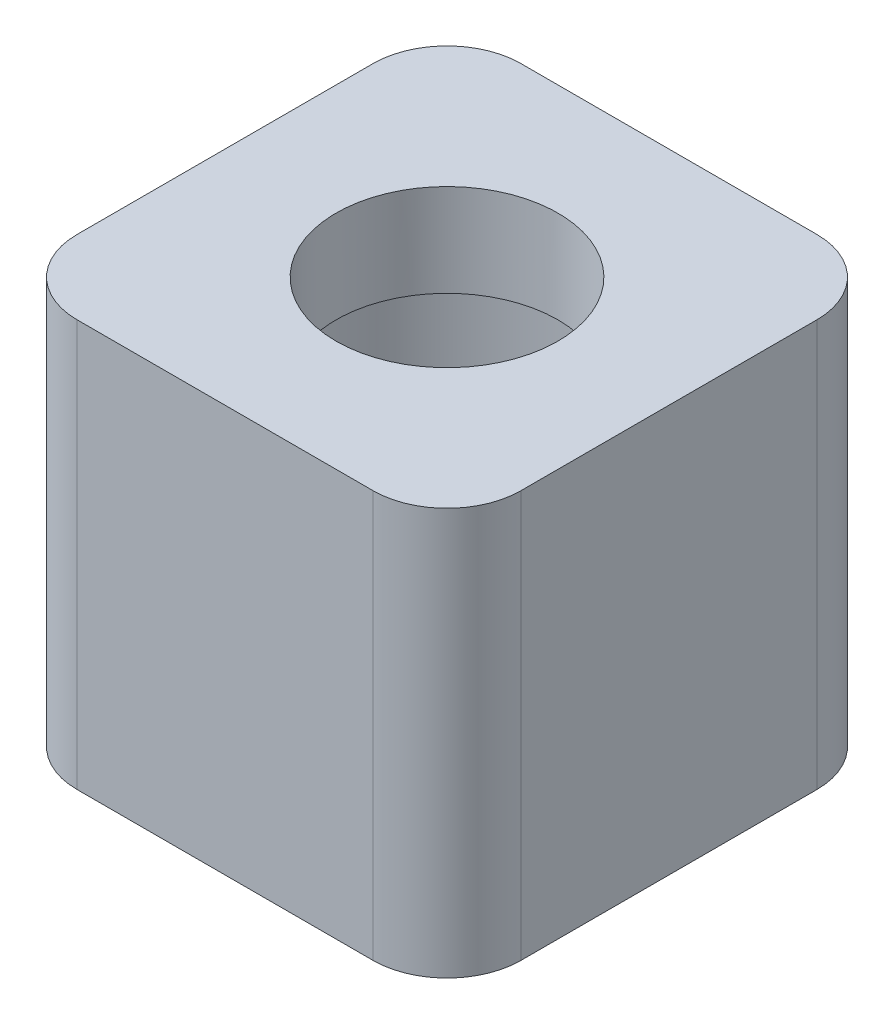
ISO-10303-21;
HEADER;
FILE_DESCRIPTION(('STEP AP214'),'2;1');
FILE_NAME('part.step','',(''),(''),'','','');
FILE_SCHEMA(('AUTOMOTIVE_DESIGN { 1 0 10303 214 1 1 1 1 }'));
ENDSEC;
DATA;
#1=APPLICATION_CONTEXT('core data for automotive mechanical design processes');
#2=APPLICATION_PROTOCOL_DEFINITION('international standard','automotive_design',2000,#1);
#3=PRODUCT_CONTEXT('',#1,'mechanical');
#4=PRODUCT('Part','Part','',(#3));
#5=PRODUCT_RELATED_PRODUCT_CATEGORY('part','',(#4));
#6=PRODUCT_DEFINITION_FORMATION('','',#4);
#7=PRODUCT_DEFINITION_CONTEXT('part definition',#1,'design');
#8=PRODUCT_DEFINITION('design','',#6,#7);
#9=PRODUCT_DEFINITION_SHAPE('','',#8);
#10=(LENGTH_UNIT() NAMED_UNIT(*) SI_UNIT(.MILLI.,.METRE.));
#11=(NAMED_UNIT(*) PLANE_ANGLE_UNIT() SI_UNIT($,.RADIAN.));
#12=(NAMED_UNIT(*) SI_UNIT($,.STERADIAN.) SOLID_ANGLE_UNIT());
#13=UNCERTAINTY_MEASURE_WITH_UNIT(LENGTH_MEASURE(1.E-05),#10,'distance_accuracy_value','');
#14=(GEOMETRIC_REPRESENTATION_CONTEXT(3) GLOBAL_UNCERTAINTY_ASSIGNED_CONTEXT((#13)) GLOBAL_UNIT_ASSIGNED_CONTEXT((#10,
#11,#12)) REPRESENTATION_CONTEXT('',''));
#15=CARTESIAN_POINT('',(0.,0.,0.));
#16=DIRECTION('',(0.,0.,1.));
#17=DIRECTION('',(1.,0.,0.));
#18=AXIS2_PLACEMENT_3D('',#15,#16,#17);
#19=CARTESIAN_POINT('',(-1.12492779512025,-4.24264068711929,-0.313350366891177));
#20=DIRECTION('',(0.,1.,0.));
#21=DIRECTION('',(0.,0.,1.));
#22=AXIS2_PLACEMENT_3D('',#19,#20,#21);
#23=CYLINDRICAL_SURFACE('',#22,1.5);
#24=CARTESIAN_POINT('',(-1.12492779512025,5.5,-0.313350366891177));
#25=DIRECTION('',(0.,1.,0.));
#26=DIRECTION('',(0.,0.,1.));
#27=AXIS2_PLACEMENT_3D('',#24,#25,#26);
#28=CIRCLE('',#27,1.5);
#29=CARTESIAN_POINT('',(-1.12492779512025,5.5,1.18664963310882));
#30=VERTEX_POINT('',#29);
#31=EDGE_CURVE('E136',#30,#30,#28,.T.);
#32=ORIENTED_EDGE('',*,*,#31,.T.);
#33=EDGE_LOOP('',(#32));
#34=FACE_BOUND('',#33,.T.);
#35=CARTESIAN_POINT('',(-1.12492779512025,4.25,-0.313350366891177));
#36=DIRECTION('',(0.,-1.,0.));
#37=DIRECTION('',(0.,0.,-1.));
#38=AXIS2_PLACEMENT_3D('',#35,#36,#37);
#39=CIRCLE('',#38,1.5);
#40=CARTESIAN_POINT('',(-1.12492779512025,4.25,-1.81335036689118));
#41=VERTEX_POINT('',#40);
#42=EDGE_CURVE('E38',#41,#41,#39,.F.);
#43=ORIENTED_EDGE('',*,*,#42,.F.);
#44=EDGE_LOOP('',(#43));
#45=FACE_BOUND('',#44,.T.);
#46=ADVANCED_FACE('F34',(#34,#45),#23,.F.);
#47=CARTESIAN_POINT('',(0.875072204879752,5.5,-2.31335036689118));
#48=DIRECTION('',(0.,-1.,0.));
#49=DIRECTION('',(0.,0.,-1.));
#50=AXIS2_PLACEMENT_3D('',#47,#48,#49);
#51=CYLINDRICAL_SURFACE('',#50,1.);
#52=CARTESIAN_POINT('',(0.875072204879752,0.,-2.31335036689118));
#53=DIRECTION('',(0.,1.,0.));
#54=DIRECTION('',(0.,0.,-1.));
#55=AXIS2_PLACEMENT_3D('',#52,#53,#54);
#56=CIRCLE('',#55,1.);
#57=CARTESIAN_POINT('',(1.87507220487975,0.,-2.31335036689117));
#58=VERTEX_POINT('',#57);
#59=CARTESIAN_POINT('',(0.875072204879745,0.,-3.31335036689118));
#60=VERTEX_POINT('',#59);
#61=EDGE_CURVE('E132',#58,#60,#56,.T.);
#62=ORIENTED_EDGE('',*,*,#61,.T.);
#63=DIRECTION('',(0.,-1.,0.));
#64=VECTOR('',#63,1.);
#65=CARTESIAN_POINT('',(0.875072204879745,5.5,-3.31335036689118));
#66=LINE('',#65,#64);
#67=CARTESIAN_POINT('',(0.875072204879745,5.5,-3.31335036689118));
#68=VERTEX_POINT('',#67);
#69=EDGE_CURVE('E11',#68,#60,#66,.T.);
#70=ORIENTED_EDGE('',*,*,#69,.F.);
#71=CARTESIAN_POINT('',(0.875072204879752,5.5,-2.31335036689118));
#72=DIRECTION('',(0.,1.,0.));
#73=DIRECTION('',(0.,0.,-1.));
#74=AXIS2_PLACEMENT_3D('',#71,#72,#73);
#75=CIRCLE('',#74,1.);
#76=CARTESIAN_POINT('',(1.87507220487975,5.5,-2.31335036689117));
#77=VERTEX_POINT('',#76);
#78=EDGE_CURVE('E147',#77,#68,#75,.T.);
#79=ORIENTED_EDGE('',*,*,#78,.F.);
#80=DIRECTION('',(0.,-1.,0.));
#81=VECTOR('',#80,1.);
#82=CARTESIAN_POINT('',(1.87507220487975,5.5,-2.31335036689117));
#83=LINE('',#82,#81);
#84=EDGE_CURVE('E128',#77,#58,#83,.T.);
#85=ORIENTED_EDGE('',*,*,#84,.T.);
#86=EDGE_LOOP('',(#62,#70,#79,#85));
#87=FACE_BOUND('',#86,.T.);
#88=ADVANCED_FACE('F36',(#87),#51,.T.);
#89=CARTESIAN_POINT('',(-3.12492779512024,5.5,-3.31335036689118));
#90=DIRECTION('',(0.,0.,1.));
#91=DIRECTION('',(1.,0.,0.));
#92=AXIS2_PLACEMENT_3D('',#89,#90,#91);
#93=PLANE('',#92);
#94=DIRECTION('',(-1.,0.,0.));
#95=VECTOR('',#94,1.);
#96=CARTESIAN_POINT('',(-3.12492779512024,0.,-3.31335036689118));
#97=LINE('',#96,#95);
#98=CARTESIAN_POINT('',(-3.12492779512024,0.,-3.31335036689118));
#99=VERTEX_POINT('',#98);
#100=EDGE_CURVE('E135',#60,#99,#97,.T.);
#101=ORIENTED_EDGE('',*,*,#100,.T.);
#102=DIRECTION('',(0.,-1.,0.));
#103=VECTOR('',#102,1.);
#104=CARTESIAN_POINT('',(-3.12492779512024,5.5,-3.31335036689118));
#105=LINE('',#104,#103);
#106=CARTESIAN_POINT('',(-3.12492779512024,5.5,-3.31335036689118));
#107=VERTEX_POINT('',#106);
#108=EDGE_CURVE('E44',#107,#99,#105,.T.);
#109=ORIENTED_EDGE('',*,*,#108,.F.);
#110=DIRECTION('',(-1.,0.,0.));
#111=VECTOR('',#110,1.);
#112=CARTESIAN_POINT('',(-3.12492779512024,5.5,-3.31335036689118));
#113=LINE('',#112,#111);
#114=EDGE_CURVE('E95',#68,#107,#113,.T.);
#115=ORIENTED_EDGE('',*,*,#114,.F.);
#116=ORIENTED_EDGE('',*,*,#69,.T.);
#117=EDGE_LOOP('',(#101,#109,#115,#116));
#118=FACE_BOUND('',#117,.T.);
#119=ADVANCED_FACE('F201',(#118),#93,.F.);
#120=CARTESIAN_POINT('',(-3.12492779512025,5.5,-2.31335036689118));
#121=DIRECTION('',(0.,-1.,0.));
#122=DIRECTION('',(0.,0.,-1.));
#123=AXIS2_PLACEMENT_3D('',#120,#121,#122);
#124=CYLINDRICAL_SURFACE('',#123,1.);
#125=CARTESIAN_POINT('',(-3.12492779512025,0.,-2.31335036689118));
#126=DIRECTION('',(0.,1.,0.));
#127=DIRECTION('',(0.,0.,1.));
#128=AXIS2_PLACEMENT_3D('',#125,#126,#127);
#129=CIRCLE('',#128,1.);
#130=CARTESIAN_POINT('',(-4.12492779512025,0.,-2.31335036689117));
#131=VERTEX_POINT('',#130);
#132=EDGE_CURVE('E138',#99,#131,#129,.T.);
#133=ORIENTED_EDGE('',*,*,#132,.T.);
#134=DIRECTION('',(0.,-1.,0.));
#135=VECTOR('',#134,1.);
#136=CARTESIAN_POINT('',(-4.12492779512025,5.5,-2.31335036689117));
#137=LINE('',#136,#135);
#138=CARTESIAN_POINT('',(-4.12492779512025,5.5,-2.31335036689117));
#139=VERTEX_POINT('',#138);
#140=EDGE_CURVE('E154',#139,#131,#137,.T.);
#141=ORIENTED_EDGE('',*,*,#140,.F.);
#142=CARTESIAN_POINT('',(-3.12492779512025,5.5,-2.31335036689118));
#143=DIRECTION('',(0.,1.,0.));
#144=DIRECTION('',(0.,0.,1.));
#145=AXIS2_PLACEMENT_3D('',#142,#143,#144);
#146=CIRCLE('',#145,1.);
#147=EDGE_CURVE('E163',#107,#139,#146,.T.);
#148=ORIENTED_EDGE('',*,*,#147,.F.);
#149=ORIENTED_EDGE('',*,*,#108,.T.);
#150=EDGE_LOOP('',(#133,#141,#148,#149));
#151=FACE_BOUND('',#150,.T.);
#152=ADVANCED_FACE('F161',(#151),#124,.T.);
#153=CARTESIAN_POINT('',(-4.12492779512025,5.5,-2.31335036689117));
#154=DIRECTION('',(1.,0.,0.));
#155=DIRECTION('',(0.,0.,-1.));
#156=AXIS2_PLACEMENT_3D('',#153,#154,#155);
#157=PLANE('',#156);
#158=DIRECTION('',(0.,0.,1.));
#159=VECTOR('',#158,1.);
#160=CARTESIAN_POINT('',(-4.12492779512025,0.,-2.31335036689117));
#161=LINE('',#160,#159);
#162=CARTESIAN_POINT('',(-4.12492779512025,0.,1.68664963310882));
#163=VERTEX_POINT('',#162);
#164=EDGE_CURVE('E140',#131,#163,#161,.T.);
#165=ORIENTED_EDGE('',*,*,#164,.T.);
#166=DIRECTION('',(0.,-1.,0.));
#167=VECTOR('',#166,1.);
#168=CARTESIAN_POINT('',(-4.12492779512025,5.5,1.68664963310882));
#169=LINE('',#168,#167);
#170=CARTESIAN_POINT('',(-4.12492779512025,5.5,1.68664963310882));
#171=VERTEX_POINT('',#170);
#172=EDGE_CURVE('E151',#171,#163,#169,.T.);
#173=ORIENTED_EDGE('',*,*,#172,.F.);
#174=DIRECTION('',(0.,0.,1.));
#175=VECTOR('',#174,1.);
#176=CARTESIAN_POINT('',(-4.12492779512025,5.5,-2.31335036689117));
#177=LINE('',#176,#175);
#178=EDGE_CURVE('E175',#139,#171,#177,.T.);
#179=ORIENTED_EDGE('',*,*,#178,.F.);
#180=ORIENTED_EDGE('',*,*,#140,.T.);
#181=EDGE_LOOP('',(#165,#173,#179,#180));
#182=FACE_BOUND('',#181,.T.);
#183=ADVANCED_FACE('F171',(#182),#157,.F.);
#184=CARTESIAN_POINT('',(-3.12492779512025,5.5,1.68664963310882));
#185=DIRECTION('',(0.,-1.,0.));
#186=DIRECTION('',(0.,0.,-1.));
#187=AXIS2_PLACEMENT_3D('',#184,#185,#186);
#188=CYLINDRICAL_SURFACE('',#187,1.);
#189=CARTESIAN_POINT('',(-3.12492779512025,0.,1.68664963310882));
#190=DIRECTION('',(0.,1.,0.));
#191=DIRECTION('',(0.,0.,1.));
#192=AXIS2_PLACEMENT_3D('',#189,#190,#191);
#193=CIRCLE('',#192,1.);
#194=CARTESIAN_POINT('',(-3.12492779512024,0.,2.68664963310882));
#195=VERTEX_POINT('',#194);
#196=EDGE_CURVE('E142',#163,#195,#193,.T.);
#197=ORIENTED_EDGE('',*,*,#196,.T.);
#198=DIRECTION('',(0.,-1.,0.));
#199=VECTOR('',#198,1.);
#200=CARTESIAN_POINT('',(-3.12492779512024,5.5,2.68664963310882));
#201=LINE('',#200,#199);
#202=CARTESIAN_POINT('',(-3.12492779512024,5.5,2.68664963310882));
#203=VERTEX_POINT('',#202);
#204=EDGE_CURVE('E123',#203,#195,#201,.T.);
#205=ORIENTED_EDGE('',*,*,#204,.F.);
#206=CARTESIAN_POINT('',(-3.12492779512025,5.5,1.68664963310882));
#207=DIRECTION('',(0.,1.,0.));
#208=DIRECTION('',(0.,0.,1.));
#209=AXIS2_PLACEMENT_3D('',#206,#207,#208);
#210=CIRCLE('',#209,1.);
#211=EDGE_CURVE('E114',#171,#203,#210,.T.);
#212=ORIENTED_EDGE('',*,*,#211,.F.);
#213=ORIENTED_EDGE('',*,*,#172,.T.);
#214=EDGE_LOOP('',(#197,#205,#212,#213));
#215=FACE_BOUND('',#214,.T.);
#216=ADVANCED_FACE('F174',(#215),#188,.T.);
#217=CARTESIAN_POINT('',(-3.12492779512024,5.5,2.68664963310882));
#218=DIRECTION('',(0.,0.,-1.));
#219=DIRECTION('',(-1.,0.,0.));
#220=AXIS2_PLACEMENT_3D('',#217,#218,#219);
#221=PLANE('',#220);
#222=DIRECTION('',(1.,0.,0.));
#223=VECTOR('',#222,1.);
#224=CARTESIAN_POINT('',(-3.12492779512024,0.,2.68664963310882));
#225=LINE('',#224,#223);
#226=CARTESIAN_POINT('',(0.875072204879746,0.,2.68664963310882));
#227=VERTEX_POINT('',#226);
#228=EDGE_CURVE('E122',#195,#227,#225,.T.);
#229=ORIENTED_EDGE('',*,*,#228,.T.);
#230=DIRECTION('',(0.,-1.,0.));
#231=VECTOR('',#230,1.);
#232=CARTESIAN_POINT('',(0.875072204879746,5.5,2.68664963310882));
#233=LINE('',#232,#231);
#234=CARTESIAN_POINT('',(0.875072204879746,5.5,2.68664963310882));
#235=VERTEX_POINT('',#234);
#236=EDGE_CURVE('E119',#235,#227,#233,.T.);
#237=ORIENTED_EDGE('',*,*,#236,.F.);
#238=DIRECTION('',(1.,0.,0.));
#239=VECTOR('',#238,1.);
#240=CARTESIAN_POINT('',(-3.12492779512024,5.5,2.68664963310882));
#241=LINE('',#240,#239);
#242=EDGE_CURVE('E108',#203,#235,#241,.T.);
#243=ORIENTED_EDGE('',*,*,#242,.F.);
#244=ORIENTED_EDGE('',*,*,#204,.T.);
#245=EDGE_LOOP('',(#229,#237,#243,#244));
#246=FACE_BOUND('',#245,.T.);
#247=ADVANCED_FACE('F120',(#246),#221,.F.);
#248=CARTESIAN_POINT('',(0.875072204879753,5.5,1.68664963310882));
#249=DIRECTION('',(0.,-1.,0.));
#250=DIRECTION('',(0.,0.,-1.));
#251=AXIS2_PLACEMENT_3D('',#248,#249,#250);
#252=CYLINDRICAL_SURFACE('',#251,1.);
#253=CARTESIAN_POINT('',(0.875072204879753,0.,1.68664963310882));
#254=DIRECTION('',(0.,1.,0.));
#255=DIRECTION('',(0.,0.,1.));
#256=AXIS2_PLACEMENT_3D('',#253,#254,#255);
#257=CIRCLE('',#256,1.);
#258=CARTESIAN_POINT('',(1.87507220487975,0.,1.68664963310882));
#259=VERTEX_POINT('',#258);
#260=EDGE_CURVE('E81',#227,#259,#257,.T.);
#261=ORIENTED_EDGE('',*,*,#260,.T.);
#262=DIRECTION('',(0.,-1.,0.));
#263=VECTOR('',#262,1.);
#264=CARTESIAN_POINT('',(1.87507220487975,5.5,1.68664963310882));
#265=LINE('',#264,#263);
#266=CARTESIAN_POINT('',(1.87507220487975,5.5,1.68664963310882));
#267=VERTEX_POINT('',#266);
#268=EDGE_CURVE('E124',#267,#259,#265,.T.);
#269=ORIENTED_EDGE('',*,*,#268,.F.);
#270=CARTESIAN_POINT('',(0.875072204879753,5.5,1.68664963310882));
#271=DIRECTION('',(0.,1.,0.));
#272=DIRECTION('',(0.,0.,1.));
#273=AXIS2_PLACEMENT_3D('',#270,#271,#272);
#274=CIRCLE('',#273,1.);
#275=EDGE_CURVE('E112',#235,#267,#274,.T.);
#276=ORIENTED_EDGE('',*,*,#275,.F.);
#277=ORIENTED_EDGE('',*,*,#236,.T.);
#278=EDGE_LOOP('',(#261,#269,#276,#277));
#279=FACE_BOUND('',#278,.T.);
#280=ADVANCED_FACE('F126',(#279),#252,.T.);
#281=CARTESIAN_POINT('',(1.87507220487975,5.5,-2.31335036689117));
#282=DIRECTION('',(-1.,0.,0.));
#283=DIRECTION('',(0.,0.,1.));
#284=AXIS2_PLACEMENT_3D('',#281,#282,#283);
#285=PLANE('',#284);
#286=DIRECTION('',(0.,0.,-1.));
#287=VECTOR('',#286,1.);
#288=CARTESIAN_POINT('',(1.87507220487975,0.,-2.31335036689117));
#289=LINE('',#288,#287);
#290=EDGE_CURVE('E87',#259,#58,#289,.T.);
#291=ORIENTED_EDGE('',*,*,#290,.T.);
#292=ORIENTED_EDGE('',*,*,#84,.F.);
#293=DIRECTION('',(0.,0.,-1.));
#294=VECTOR('',#293,1.);
#295=CARTESIAN_POINT('',(1.87507220487975,5.5,-2.31335036689117));
#296=LINE('',#295,#294);
#297=EDGE_CURVE('E52',#267,#77,#296,.T.);
#298=ORIENTED_EDGE('',*,*,#297,.F.);
#299=ORIENTED_EDGE('',*,*,#268,.T.);
#300=EDGE_LOOP('',(#291,#292,#298,#299));
#301=FACE_BOUND('',#300,.T.);
#302=ADVANCED_FACE('F209',(#301),#285,.F.);
#303=CARTESIAN_POINT('',(0.875072204879752,5.5,-2.31335036689118));
#304=DIRECTION('',(0.,-1.,0.));
#305=DIRECTION('',(0.,0.,-1.));
#306=AXIS2_PLACEMENT_3D('',#303,#304,#305);
#307=PLANE('',#306);
#308=ORIENTED_EDGE('',*,*,#31,.F.);
#309=EDGE_LOOP('',(#308));
#310=FACE_BOUND('',#309,.T.);
#311=ORIENTED_EDGE('',*,*,#78,.T.);
#312=ORIENTED_EDGE('',*,*,#114,.T.);
#313=ORIENTED_EDGE('',*,*,#147,.T.);
#314=ORIENTED_EDGE('',*,*,#178,.T.);
#315=ORIENTED_EDGE('',*,*,#211,.T.);
#316=ORIENTED_EDGE('',*,*,#242,.T.);
#317=ORIENTED_EDGE('',*,*,#275,.T.);
#318=ORIENTED_EDGE('',*,*,#297,.T.);
#319=EDGE_LOOP('',(#311,#312,#313,#314,#315,#316,#317,#318));
#320=FACE_BOUND('',#319,.T.);
#321=ADVANCED_FACE('F110',(#310,#320),#307,.F.);
#322=CARTESIAN_POINT('',(0.875072204879752,0.,-2.31335036689118));
#323=DIRECTION('',(0.,-1.,0.));
#324=DIRECTION('',(0.,0.,-1.));
#325=AXIS2_PLACEMENT_3D('',#322,#323,#324);
#326=PLANE('',#325);
#327=CARTESIAN_POINT('',(-1.12492779512025,0.,-0.313350366891177));
#328=DIRECTION('',(0.,-1.,0.));
#329=DIRECTION('',(0.,0.,-1.));
#330=AXIS2_PLACEMENT_3D('',#327,#328,#329);
#331=CIRCLE('',#330,2.25);
#332=CARTESIAN_POINT('',(-1.12492779512025,0.,-2.56335036689118));
#333=VERTEX_POINT('',#332);
#334=EDGE_CURVE('E183',#333,#333,#331,.T.);
#335=ORIENTED_EDGE('',*,*,#334,.F.);
#336=EDGE_LOOP('',(#335));
#337=FACE_BOUND('',#336,.T.);
#338=ORIENTED_EDGE('',*,*,#61,.F.);
#339=ORIENTED_EDGE('',*,*,#290,.F.);
#340=ORIENTED_EDGE('',*,*,#260,.F.);
#341=ORIENTED_EDGE('',*,*,#228,.F.);
#342=ORIENTED_EDGE('',*,*,#196,.F.);
#343=ORIENTED_EDGE('',*,*,#164,.F.);
#344=ORIENTED_EDGE('',*,*,#132,.F.);
#345=ORIENTED_EDGE('',*,*,#100,.F.);
#346=EDGE_LOOP('',(#338,#339,#340,#341,#342,#343,#344,#345));
#347=FACE_BOUND('',#346,.T.);
#348=ADVANCED_FACE('F167',(#337,#347),#326,.T.);
#349=CARTESIAN_POINT('',(-1.12492779512025,4.25,-0.313350366891177));
#350=DIRECTION('',(0.,-1.,0.));
#351=DIRECTION('',(0.,0.,-1.));
#352=AXIS2_PLACEMENT_3D('',#349,#350,#351);
#353=PLANE('',#352);
#354=CARTESIAN_POINT('',(-1.12492779512025,4.25,-0.313350366891177));
#355=DIRECTION('',(0.,-1.,0.));
#356=DIRECTION('',(0.,0.,-1.));
#357=AXIS2_PLACEMENT_3D('',#354,#355,#356);
#358=CIRCLE('',#357,2.25);
#359=CARTESIAN_POINT('',(-1.12492779512025,4.25,-2.56335036689118));
#360=VERTEX_POINT('',#359);
#361=EDGE_CURVE('E186',#360,#360,#358,.T.);
#362=ORIENTED_EDGE('',*,*,#361,.T.);
#363=EDGE_LOOP('',(#362));
#364=FACE_BOUND('',#363,.T.);
#365=ORIENTED_EDGE('',*,*,#42,.T.);
#366=EDGE_LOOP('',(#365));
#367=FACE_BOUND('',#366,.T.);
#368=ADVANCED_FACE('F193',(#364,#367),#353,.T.);
#369=CARTESIAN_POINT('',(-1.12492779512025,4.25,-0.313350366891177));
#370=DIRECTION('',(0.,-1.,0.));
#371=DIRECTION('',(0.,0.,-1.));
#372=AXIS2_PLACEMENT_3D('',#369,#370,#371);
#373=CYLINDRICAL_SURFACE('',#372,2.25);
#374=ORIENTED_EDGE('',*,*,#361,.F.);
#375=EDGE_LOOP('',(#374));
#376=FACE_BOUND('',#375,.T.);
#377=ORIENTED_EDGE('',*,*,#334,.T.);
#378=EDGE_LOOP('',(#377));
#379=FACE_BOUND('',#378,.T.);
#380=ADVANCED_FACE('F205',(#376,#379),#373,.F.);
#381=CLOSED_SHELL('',(#46,#88,#119,#152,#183,#216,#247,#280,#302,#321,#348,#368,#380));
#382=MANIFOLD_SOLID_BREP('B2',#381);
#383=ADVANCED_BREP_SHAPE_REPRESENTATION('',(#18,#382),#14);
#384=SHAPE_DEFINITION_REPRESENTATION(#9,#383);
ENDSEC;
END-ISO-10303-21;
